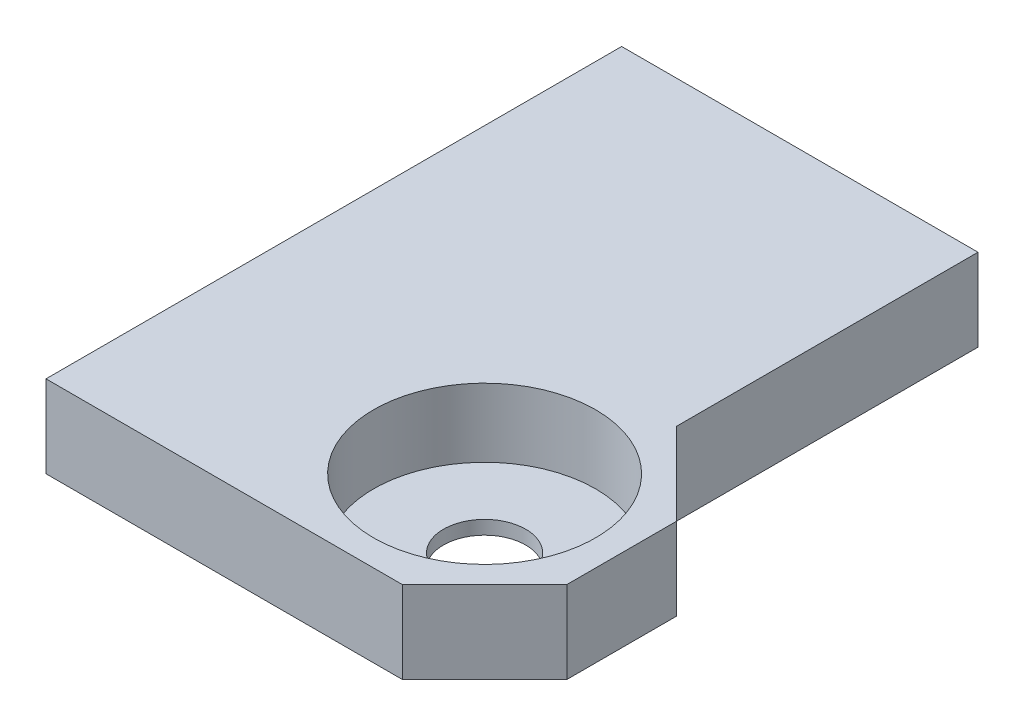
ISO-10303-21;
HEADER;
FILE_DESCRIPTION(('STEP AP214'),'2;1');
FILE_NAME('part.step','',(''),(''),'','','');
FILE_SCHEMA(('AUTOMOTIVE_DESIGN { 1 0 10303 214 1 1 1 1 }'));
ENDSEC;
DATA;
#1=APPLICATION_CONTEXT('core data for automotive mechanical design processes');
#2=APPLICATION_PROTOCOL_DEFINITION('international standard','automotive_design',2000,#1);
#3=PRODUCT_CONTEXT('',#1,'mechanical');
#4=PRODUCT('Part','Part','',(#3));
#5=PRODUCT_RELATED_PRODUCT_CATEGORY('part','',(#4));
#6=PRODUCT_DEFINITION_FORMATION('','',#4);
#7=PRODUCT_DEFINITION_CONTEXT('part definition',#1,'design');
#8=PRODUCT_DEFINITION('design','',#6,#7);
#9=PRODUCT_DEFINITION_SHAPE('','',#8);
#10=(LENGTH_UNIT() NAMED_UNIT(*) SI_UNIT(.MILLI.,.METRE.));
#11=(NAMED_UNIT(*) PLANE_ANGLE_UNIT() SI_UNIT($,.RADIAN.));
#12=(NAMED_UNIT(*) SI_UNIT($,.STERADIAN.) SOLID_ANGLE_UNIT());
#13=UNCERTAINTY_MEASURE_WITH_UNIT(LENGTH_MEASURE(1.E-05),#10,'distance_accuracy_value','');
#14=(GEOMETRIC_REPRESENTATION_CONTEXT(3) GLOBAL_UNCERTAINTY_ASSIGNED_CONTEXT((#13)) GLOBAL_UNIT_ASSIGNED_CONTEXT((#10,
#11,#12)) REPRESENTATION_CONTEXT('',''));
#15=CARTESIAN_POINT('',(0.,0.,0.));
#16=DIRECTION('',(0.,0.,1.));
#17=DIRECTION('',(1.,0.,0.));
#18=AXIS2_PLACEMENT_3D('',#15,#16,#17);
#19=CARTESIAN_POINT('',(22.,6.,-10.));
#20=DIRECTION('',(0.,-1.,0.));
#21=DIRECTION('',(0.,0.,-1.));
#22=AXIS2_PLACEMENT_3D('',#19,#20,#21);
#23=CYLINDRICAL_SURFACE('',#22,2.99999999999999);
#24=CARTESIAN_POINT('',(22.,0.,-10.));
#25=DIRECTION('',(0.,1.,0.));
#26=DIRECTION('',(0.,0.,1.));
#27=AXIS2_PLACEMENT_3D('',#24,#25,#26);
#28=CIRCLE('',#27,2.99999999999999);
#29=CARTESIAN_POINT('',(22.,0.,-7.00000000000001));
#30=VERTEX_POINT('',#29);
#31=EDGE_CURVE('E169',#30,#30,#28,.T.);
#32=ORIENTED_EDGE('',*,*,#31,.F.);
#33=EDGE_LOOP('',(#32));
#34=FACE_BOUND('',#33,.T.);
#35=CARTESIAN_POINT('',(22.,1.,-10.));
#36=DIRECTION('',(0.,1.,0.));
#37=DIRECTION('',(0.,0.,1.));
#38=AXIS2_PLACEMENT_3D('',#35,#36,#37);
#39=CIRCLE('',#38,2.99999999999999);
#40=CARTESIAN_POINT('',(22.,1.,-7.00000000000001));
#41=VERTEX_POINT('',#40);
#42=EDGE_CURVE('E44',#41,#41,#39,.T.);
#43=ORIENTED_EDGE('',*,*,#42,.T.);
#44=EDGE_LOOP('',(#43));
#45=FACE_BOUND('',#44,.T.);
#46=ADVANCED_FACE('F39',(#34,#45),#23,.F.);
#47=CARTESIAN_POINT('',(0.,6.,0.));
#48=DIRECTION('',(0.,1.,0.));
#49=DIRECTION('',(0.,0.,1.));
#50=AXIS2_PLACEMENT_3D('',#47,#48,#49);
#51=PLANE('',#50);
#52=CARTESIAN_POINT('',(22.,6.,-10.));
#53=DIRECTION('',(0.,1.,0.));
#54=DIRECTION('',(0.,0.,1.));
#55=AXIS2_PLACEMENT_3D('',#52,#53,#54);
#56=CIRCLE('',#55,8.1);
#57=CARTESIAN_POINT('',(22.,6.,-1.9));
#58=VERTEX_POINT('',#57);
#59=EDGE_CURVE('E175',#58,#58,#56,.T.);
#60=ORIENTED_EDGE('',*,*,#59,.F.);
#61=EDGE_LOOP('',(#60));
#62=FACE_BOUND('',#61,.T.);
#63=DIRECTION('',(1.,0.,0.));
#64=VECTOR('',#63,1.);
#65=CARTESIAN_POINT('',(0.,6.,0.));
#66=LINE('',#65,#64);
#67=CARTESIAN_POINT('',(0.,6.,0.));
#68=VERTEX_POINT('',#67);
#69=CARTESIAN_POINT('',(26.,6.,0.));
#70=VERTEX_POINT('',#69);
#71=EDGE_CURVE('E97',#68,#70,#66,.T.);
#72=ORIENTED_EDGE('',*,*,#71,.T.);
#73=DIRECTION('',(-0.707106781186548,0.,0.707106781186547));
#74=VECTOR('',#73,1.);
#75=CARTESIAN_POINT('',(13.,6.,13.));
#76=LINE('',#75,#74);
#77=CARTESIAN_POINT('',(32.,6.,-6.00000000000001));
#78=VERTEX_POINT('',#77);
#79=EDGE_CURVE('E11',#70,#78,#76,.F.);
#80=ORIENTED_EDGE('',*,*,#79,.T.);
#81=DIRECTION('',(0.,0.,-1.));
#82=VECTOR('',#81,1.);
#83=CARTESIAN_POINT('',(32.,6.,0.));
#84=LINE('',#83,#82);
#85=CARTESIAN_POINT('',(32.,6.,-14.));
#86=VERTEX_POINT('',#85);
#87=EDGE_CURVE('E105',#78,#86,#84,.T.);
#88=ORIENTED_EDGE('',*,*,#87,.T.);
#89=DIRECTION('',(0.707106781186547,0.,0.707106781186548));
#90=VECTOR('',#89,1.);
#91=CARTESIAN_POINT('',(23.,6.,-23.));
#92=LINE('',#91,#90);
#93=CARTESIAN_POINT('',(26.,6.,-20.));
#94=VERTEX_POINT('',#93);
#95=EDGE_CURVE('E49',#86,#94,#92,.F.);
#96=ORIENTED_EDGE('',*,*,#95,.T.);
#97=DIRECTION('',(0.,0.,-1.));
#98=VECTOR('',#97,1.);
#99=CARTESIAN_POINT('',(26.,6.,-20.));
#100=LINE('',#99,#98);
#101=CARTESIAN_POINT('',(26.,6.,-42.));
#102=VERTEX_POINT('',#101);
#103=EDGE_CURVE('E139',#94,#102,#100,.T.);
#104=ORIENTED_EDGE('',*,*,#103,.T.);
#105=DIRECTION('',(-1.,0.,0.));
#106=VECTOR('',#105,1.);
#107=CARTESIAN_POINT('',(26.,6.,-42.));
#108=LINE('',#107,#106);
#109=CARTESIAN_POINT('',(0.,6.,-42.));
#110=VERTEX_POINT('',#109);
#111=EDGE_CURVE('E111',#102,#110,#108,.T.);
#112=ORIENTED_EDGE('',*,*,#111,.T.);
#113=DIRECTION('',(0.,0.,1.));
#114=VECTOR('',#113,1.);
#115=CARTESIAN_POINT('',(0.,6.,-42.));
#116=LINE('',#115,#114);
#117=EDGE_CURVE('E106',#110,#68,#116,.T.);
#118=ORIENTED_EDGE('',*,*,#117,.T.);
#119=EDGE_LOOP('',(#72,#80,#88,#96,#104,#112,#118));
#120=FACE_BOUND('',#119,.T.);
#121=ADVANCED_FACE('F109',(#62,#120),#51,.T.);
#122=CARTESIAN_POINT('',(0.,0.,0.));
#123=DIRECTION('',(0.,1.,0.));
#124=DIRECTION('',(0.,0.,1.));
#125=AXIS2_PLACEMENT_3D('',#122,#123,#124);
#126=PLANE('',#125);
#127=DIRECTION('',(0.,0.,-1.));
#128=VECTOR('',#127,1.);
#129=CARTESIAN_POINT('',(32.,0.,0.));
#130=LINE('',#129,#128);
#131=CARTESIAN_POINT('',(32.,0.,-6.00000000000001));
#132=VERTEX_POINT('',#131);
#133=CARTESIAN_POINT('',(32.,0.,-14.));
#134=VERTEX_POINT('',#133);
#135=EDGE_CURVE('E153',#132,#134,#130,.T.);
#136=ORIENTED_EDGE('',*,*,#135,.F.);
#137=DIRECTION('',(0.707106781186548,0.,-0.707106781186547));
#138=VECTOR('',#137,1.);
#139=CARTESIAN_POINT('',(32.,0.,-6.00000000000001));
#140=LINE('',#139,#138);
#141=CARTESIAN_POINT('',(26.,0.,0.));
#142=VERTEX_POINT('',#141);
#143=EDGE_CURVE('E64',#132,#142,#140,.F.);
#144=ORIENTED_EDGE('',*,*,#143,.T.);
#145=DIRECTION('',(1.,0.,0.));
#146=VECTOR('',#145,1.);
#147=CARTESIAN_POINT('',(0.,0.,0.));
#148=LINE('',#147,#146);
#149=CARTESIAN_POINT('',(0.,0.,0.));
#150=VERTEX_POINT('',#149);
#151=EDGE_CURVE('E159',#150,#142,#148,.T.);
#152=ORIENTED_EDGE('',*,*,#151,.F.);
#153=DIRECTION('',(0.,0.,1.));
#154=VECTOR('',#153,1.);
#155=CARTESIAN_POINT('',(0.,0.,-42.));
#156=LINE('',#155,#154);
#157=CARTESIAN_POINT('',(0.,0.,-42.));
#158=VERTEX_POINT('',#157);
#159=EDGE_CURVE('E119',#158,#150,#156,.T.);
#160=ORIENTED_EDGE('',*,*,#159,.F.);
#161=DIRECTION('',(-1.,0.,0.));
#162=VECTOR('',#161,1.);
#163=CARTESIAN_POINT('',(26.,0.,-42.));
#164=LINE('',#163,#162);
#165=CARTESIAN_POINT('',(26.,0.,-42.));
#166=VERTEX_POINT('',#165);
#167=EDGE_CURVE('E115',#166,#158,#164,.T.);
#168=ORIENTED_EDGE('',*,*,#167,.F.);
#169=DIRECTION('',(0.,0.,-1.));
#170=VECTOR('',#169,1.);
#171=CARTESIAN_POINT('',(26.,0.,-20.));
#172=LINE('',#171,#170);
#173=CARTESIAN_POINT('',(26.,0.,-20.));
#174=VERTEX_POINT('',#173);
#175=EDGE_CURVE('E155',#174,#166,#172,.T.);
#176=ORIENTED_EDGE('',*,*,#175,.F.);
#177=DIRECTION('',(-0.707106781186547,0.,-0.707106781186548));
#178=VECTOR('',#177,1.);
#179=CARTESIAN_POINT('',(26.,0.,-20.));
#180=LINE('',#179,#178);
#181=EDGE_CURVE('E132',#174,#134,#180,.F.);
#182=ORIENTED_EDGE('',*,*,#181,.T.);
#183=EDGE_LOOP('',(#136,#144,#152,#160,#168,#176,#182));
#184=FACE_BOUND('',#183,.T.);
#185=ORIENTED_EDGE('',*,*,#31,.T.);
#186=EDGE_LOOP('',(#185));
#187=FACE_BOUND('',#186,.T.);
#188=ADVANCED_FACE('F151',(#184,#187),#126,.F.);
#189=CARTESIAN_POINT('',(0.,6.,-42.));
#190=DIRECTION('',(1.,0.,0.));
#191=DIRECTION('',(0.,0.,-1.));
#192=AXIS2_PLACEMENT_3D('',#189,#190,#191);
#193=PLANE('',#192);
#194=ORIENTED_EDGE('',*,*,#159,.T.);
#195=DIRECTION('',(0.,-1.,0.));
#196=VECTOR('',#195,1.);
#197=CARTESIAN_POINT('',(0.,6.,0.));
#198=LINE('',#197,#196);
#199=EDGE_CURVE('E101',#68,#150,#198,.T.);
#200=ORIENTED_EDGE('',*,*,#199,.F.);
#201=ORIENTED_EDGE('',*,*,#117,.F.);
#202=DIRECTION('',(0.,-1.,0.));
#203=VECTOR('',#202,1.);
#204=CARTESIAN_POINT('',(0.,6.,-42.));
#205=LINE('',#204,#203);
#206=EDGE_CURVE('E166',#110,#158,#205,.T.);
#207=ORIENTED_EDGE('',*,*,#206,.T.);
#208=EDGE_LOOP('',(#194,#200,#201,#207));
#209=FACE_BOUND('',#208,.T.);
#210=ADVANCED_FACE('F117',(#209),#193,.F.);
#211=CARTESIAN_POINT('',(0.,6.,0.));
#212=DIRECTION('',(0.,0.,-1.));
#213=DIRECTION('',(-1.,0.,0.));
#214=AXIS2_PLACEMENT_3D('',#211,#212,#213);
#215=PLANE('',#214);
#216=ORIENTED_EDGE('',*,*,#151,.T.);
#217=DIRECTION('',(0.,1.,0.));
#218=VECTOR('',#217,1.);
#219=CARTESIAN_POINT('',(26.,6.,0.));
#220=LINE('',#219,#218);
#221=EDGE_CURVE('E56',#142,#70,#220,.T.);
#222=ORIENTED_EDGE('',*,*,#221,.T.);
#223=ORIENTED_EDGE('',*,*,#71,.F.);
#224=ORIENTED_EDGE('',*,*,#199,.T.);
#225=EDGE_LOOP('',(#216,#222,#223,#224));
#226=FACE_BOUND('',#225,.T.);
#227=ADVANCED_FACE('F99',(#226),#215,.F.);
#228=CARTESIAN_POINT('',(32.,6.,0.));
#229=DIRECTION('',(-1.,0.,0.));
#230=DIRECTION('',(0.,0.,1.));
#231=AXIS2_PLACEMENT_3D('',#228,#229,#230);
#232=PLANE('',#231);
#233=ORIENTED_EDGE('',*,*,#87,.F.);
#234=DIRECTION('',(0.,-1.,0.));
#235=VECTOR('',#234,1.);
#236=CARTESIAN_POINT('',(32.,6.,-6.00000000000001));
#237=LINE('',#236,#235);
#238=EDGE_CURVE('E123',#78,#132,#237,.T.);
#239=ORIENTED_EDGE('',*,*,#238,.T.);
#240=ORIENTED_EDGE('',*,*,#135,.T.);
#241=DIRECTION('',(0.,1.,0.));
#242=VECTOR('',#241,1.);
#243=CARTESIAN_POINT('',(32.,6.,-14.));
#244=LINE('',#243,#242);
#245=EDGE_CURVE('E120',#134,#86,#244,.T.);
#246=ORIENTED_EDGE('',*,*,#245,.T.);
#247=EDGE_LOOP('',(#233,#239,#240,#246));
#248=FACE_BOUND('',#247,.T.);
#249=ADVANCED_FACE('F157',(#248),#232,.F.);
#250=CARTESIAN_POINT('',(26.,6.,-20.));
#251=DIRECTION('',(-1.,0.,0.));
#252=DIRECTION('',(0.,0.,1.));
#253=AXIS2_PLACEMENT_3D('',#250,#251,#252);
#254=PLANE('',#253);
#255=ORIENTED_EDGE('',*,*,#175,.T.);
#256=DIRECTION('',(0.,-1.,0.));
#257=VECTOR('',#256,1.);
#258=CARTESIAN_POINT('',(26.,6.,-42.));
#259=LINE('',#258,#257);
#260=EDGE_CURVE('E126',#102,#166,#259,.T.);
#261=ORIENTED_EDGE('',*,*,#260,.F.);
#262=ORIENTED_EDGE('',*,*,#103,.F.);
#263=DIRECTION('',(0.,-1.,0.));
#264=VECTOR('',#263,1.);
#265=CARTESIAN_POINT('',(26.,6.,-20.));
#266=LINE('',#265,#264);
#267=EDGE_CURVE('E121',#94,#174,#266,.T.);
#268=ORIENTED_EDGE('',*,*,#267,.T.);
#269=EDGE_LOOP('',(#255,#261,#262,#268));
#270=FACE_BOUND('',#269,.T.);
#271=ADVANCED_FACE('F146',(#270),#254,.F.);
#272=CARTESIAN_POINT('',(26.,6.,-42.));
#273=DIRECTION('',(0.,0.,1.));
#274=DIRECTION('',(1.,0.,0.));
#275=AXIS2_PLACEMENT_3D('',#272,#273,#274);
#276=PLANE('',#275);
#277=ORIENTED_EDGE('',*,*,#167,.T.);
#278=ORIENTED_EDGE('',*,*,#206,.F.);
#279=ORIENTED_EDGE('',*,*,#111,.F.);
#280=ORIENTED_EDGE('',*,*,#260,.T.);
#281=EDGE_LOOP('',(#277,#278,#279,#280));
#282=FACE_BOUND('',#281,.T.);
#283=ADVANCED_FACE('F168',(#282),#276,.F.);
#284=CARTESIAN_POINT('',(32.,6.,-6.00000000000001));
#285=DIRECTION('',(-0.707106781186547,0.,-0.707106781186548));
#286=DIRECTION('',(0.,-1.,0.));
#287=AXIS2_PLACEMENT_3D('',#284,#285,#286);
#288=PLANE('',#287);
#289=ORIENTED_EDGE('',*,*,#79,.F.);
#290=ORIENTED_EDGE('',*,*,#221,.F.);
#291=ORIENTED_EDGE('',*,*,#143,.F.);
#292=ORIENTED_EDGE('',*,*,#238,.F.);
#293=EDGE_LOOP('',(#289,#290,#291,#292));
#294=FACE_BOUND('',#293,.T.);
#295=ADVANCED_FACE('F209',(#294),#288,.F.);
#296=CARTESIAN_POINT('',(26.,6.,-20.));
#297=DIRECTION('',(-0.707106781186548,0.,0.707106781186547));
#298=DIRECTION('',(0.,-1.,0.));
#299=AXIS2_PLACEMENT_3D('',#296,#297,#298);
#300=PLANE('',#299);
#301=ORIENTED_EDGE('',*,*,#95,.F.);
#302=ORIENTED_EDGE('',*,*,#245,.F.);
#303=ORIENTED_EDGE('',*,*,#181,.F.);
#304=ORIENTED_EDGE('',*,*,#267,.F.);
#305=EDGE_LOOP('',(#301,#302,#303,#304));
#306=FACE_BOUND('',#305,.T.);
#307=ADVANCED_FACE('F42',(#306),#300,.F.);
#308=CARTESIAN_POINT('',(22.,1.,-10.));
#309=DIRECTION('',(0.,1.,0.));
#310=DIRECTION('',(0.,0.,1.));
#311=AXIS2_PLACEMENT_3D('',#308,#309,#310);
#312=CYLINDRICAL_SURFACE('',#311,8.1);
#313=CARTESIAN_POINT('',(22.,1.,-10.));
#314=DIRECTION('',(0.,1.,0.));
#315=DIRECTION('',(0.,0.,1.));
#316=AXIS2_PLACEMENT_3D('',#313,#314,#315);
#317=CIRCLE('',#316,8.1);
#318=CARTESIAN_POINT('',(22.,1.,-1.9));
#319=VERTEX_POINT('',#318);
#320=EDGE_CURVE('E178',#319,#319,#317,.T.);
#321=ORIENTED_EDGE('',*,*,#320,.F.);
#322=EDGE_LOOP('',(#321));
#323=FACE_BOUND('',#322,.T.);
#324=ORIENTED_EDGE('',*,*,#59,.T.);
#325=EDGE_LOOP('',(#324));
#326=FACE_BOUND('',#325,.T.);
#327=ADVANCED_FACE('F188',(#323,#326),#312,.F.);
#328=CARTESIAN_POINT('',(22.,1.,-10.));
#329=DIRECTION('',(0.,1.,0.));
#330=DIRECTION('',(0.,0.,1.));
#331=AXIS2_PLACEMENT_3D('',#328,#329,#330);
#332=PLANE('',#331);
#333=ORIENTED_EDGE('',*,*,#42,.F.);
#334=EDGE_LOOP('',(#333));
#335=FACE_BOUND('',#334,.T.);
#336=ORIENTED_EDGE('',*,*,#320,.T.);
#337=EDGE_LOOP('',(#336));
#338=FACE_BOUND('',#337,.T.);
#339=ADVANCED_FACE('F186',(#335,#338),#332,.T.);
#340=CLOSED_SHELL('',(#46,#121,#188,#210,#227,#249,#271,#283,#295,#307,#327,#339));
#341=MANIFOLD_SOLID_BREP('B2',#340);
#342=ADVANCED_BREP_SHAPE_REPRESENTATION('',(#18,#341),#14);
#343=SHAPE_DEFINITION_REPRESENTATION(#9,#342);
ENDSEC;
END-ISO-10303-21;
